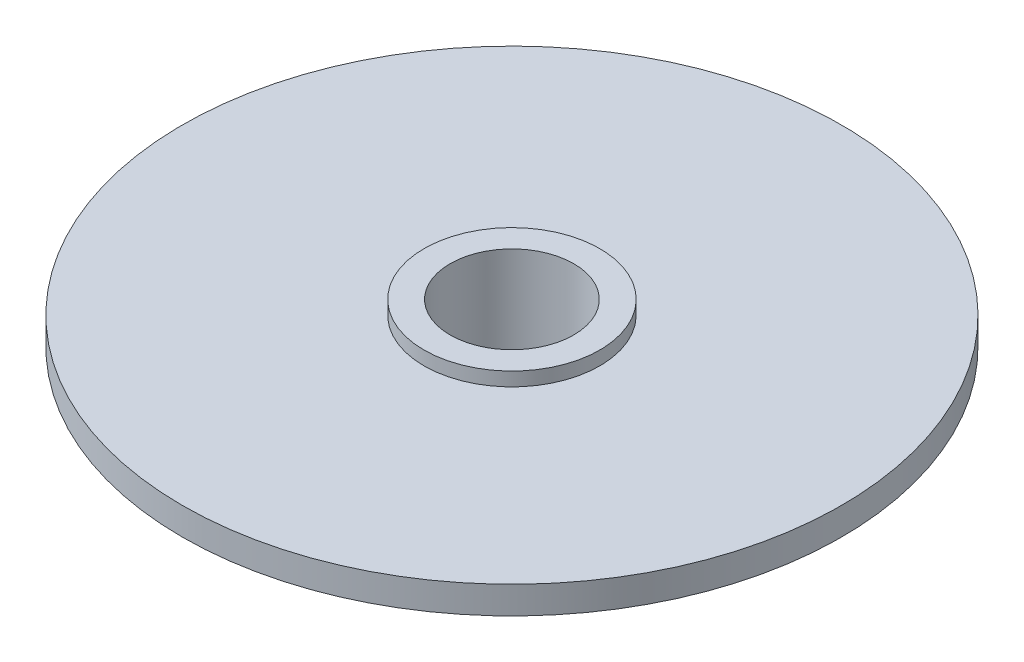
ISO-10303-21;
HEADER;
FILE_DESCRIPTION(('STEP AP214'),'2;1');
FILE_NAME('part.step','',(''),(''),'','','');
FILE_SCHEMA(('AUTOMOTIVE_DESIGN { 1 0 10303 214 1 1 1 1 }'));
ENDSEC;
DATA;
#1=APPLICATION_CONTEXT('core data for automotive mechanical design processes');
#2=APPLICATION_PROTOCOL_DEFINITION('international standard','automotive_design',2000,#1);
#3=PRODUCT_CONTEXT('',#1,'mechanical');
#4=PRODUCT('Part','Part','',(#3));
#5=PRODUCT_RELATED_PRODUCT_CATEGORY('part','',(#4));
#6=PRODUCT_DEFINITION_FORMATION('','',#4);
#7=PRODUCT_DEFINITION_CONTEXT('part definition',#1,'design');
#8=PRODUCT_DEFINITION('design','',#6,#7);
#9=PRODUCT_DEFINITION_SHAPE('','',#8);
#10=(LENGTH_UNIT() NAMED_UNIT(*) SI_UNIT(.MILLI.,.METRE.));
#11=(NAMED_UNIT(*) PLANE_ANGLE_UNIT() SI_UNIT($,.RADIAN.));
#12=(NAMED_UNIT(*) SI_UNIT($,.STERADIAN.) SOLID_ANGLE_UNIT());
#13=UNCERTAINTY_MEASURE_WITH_UNIT(LENGTH_MEASURE(1.E-05),#10,'distance_accuracy_value','');
#14=(GEOMETRIC_REPRESENTATION_CONTEXT(3) GLOBAL_UNCERTAINTY_ASSIGNED_CONTEXT((#13)) GLOBAL_UNIT_ASSIGNED_CONTEXT((#10,
#11,#12)) REPRESENTATION_CONTEXT('',''));
#15=CARTESIAN_POINT('',(0.,0.,0.));
#16=DIRECTION('',(0.,0.,1.));
#17=DIRECTION('',(1.,0.,0.));
#18=AXIS2_PLACEMENT_3D('',#15,#16,#17);
#19=CARTESIAN_POINT('',(0.,10.,0.));
#20=DIRECTION('',(0.,1.,0.));
#21=DIRECTION('',(0.,0.,1.));
#22=AXIS2_PLACEMENT_3D('',#19,#20,#21);
#23=PLANE('',#22);
#24=CARTESIAN_POINT('',(0.,10.,0.));
#25=DIRECTION('',(0.,1.,0.));
#26=DIRECTION('',(0.,0.,1.));
#27=AXIS2_PLACEMENT_3D('',#24,#25,#26);
#28=CIRCLE('',#27,120.);
#29=CARTESIAN_POINT('',(0.,10.,120.));
#30=VERTEX_POINT('',#29);
#31=EDGE_CURVE('E38',#30,#30,#28,.T.);
#32=ORIENTED_EDGE('',*,*,#31,.T.);
#33=EDGE_LOOP('',(#32));
#34=FACE_BOUND('',#33,.T.);
#35=CARTESIAN_POINT('',(0.,10.,0.));
#36=DIRECTION('',(0.,1.,0.));
#37=DIRECTION('',(0.,0.,1.));
#38=AXIS2_PLACEMENT_3D('',#35,#36,#37);
#39=CIRCLE('',#38,32.);
#40=CARTESIAN_POINT('',(0.,10.,32.));
#41=VERTEX_POINT('',#40);
#42=EDGE_CURVE('E55',#41,#41,#39,.T.);
#43=ORIENTED_EDGE('',*,*,#42,.F.);
#44=EDGE_LOOP('',(#43));
#45=FACE_BOUND('',#44,.T.);
#46=ADVANCED_FACE('F31',(#34,#45),#23,.T.);
#47=CARTESIAN_POINT('',(0.,0.,0.));
#48=DIRECTION('',(0.,1.,0.));
#49=DIRECTION('',(0.,0.,1.));
#50=AXIS2_PLACEMENT_3D('',#47,#48,#49);
#51=PLANE('',#50);
#52=CARTESIAN_POINT('',(0.,0.,0.));
#53=DIRECTION('',(0.,1.,0.));
#54=DIRECTION('',(0.,0.,1.));
#55=AXIS2_PLACEMENT_3D('',#52,#53,#54);
#56=CIRCLE('',#55,120.);
#57=CARTESIAN_POINT('',(0.,0.,120.));
#58=VERTEX_POINT('',#57);
#59=EDGE_CURVE('E42',#58,#58,#56,.T.);
#60=ORIENTED_EDGE('',*,*,#59,.F.);
#61=EDGE_LOOP('',(#60));
#62=FACE_BOUND('',#61,.T.);
#63=CARTESIAN_POINT('',(0.,0.,0.));
#64=DIRECTION('',(0.,1.,0.));
#65=DIRECTION('',(0.,0.,1.));
#66=AXIS2_PLACEMENT_3D('',#63,#64,#65);
#67=CIRCLE('',#66,32.);
#68=CARTESIAN_POINT('',(0.,0.,32.));
#69=VERTEX_POINT('',#68);
#70=EDGE_CURVE('E10',#69,#69,#67,.F.);
#71=ORIENTED_EDGE('',*,*,#70,.F.);
#72=EDGE_LOOP('',(#71));
#73=FACE_BOUND('',#72,.T.);
#74=ADVANCED_FACE('F82',(#62,#73),#51,.F.);
#75=CARTESIAN_POINT('',(0.,10.,0.));
#76=DIRECTION('',(0.,-1.,0.));
#77=DIRECTION('',(0.,0.,-1.));
#78=AXIS2_PLACEMENT_3D('',#75,#76,#77);
#79=CYLINDRICAL_SURFACE('',#78,120.);
#80=ORIENTED_EDGE('',*,*,#31,.F.);
#81=EDGE_LOOP('',(#80));
#82=FACE_BOUND('',#81,.T.);
#83=ORIENTED_EDGE('',*,*,#59,.T.);
#84=EDGE_LOOP('',(#83));
#85=FACE_BOUND('',#84,.T.);
#86=ADVANCED_FACE('F33',(#82,#85),#79,.T.);
#87=CARTESIAN_POINT('',(0.,10.,0.));
#88=DIRECTION('',(0.,-1.,0.));
#89=DIRECTION('',(0.,0.,-1.));
#90=AXIS2_PLACEMENT_3D('',#87,#88,#89);
#91=CYLINDRICAL_SURFACE('',#90,22.5);
#92=CARTESIAN_POINT('',(0.,-40.,0.));
#93=DIRECTION('',(0.,-1.,0.));
#94=DIRECTION('',(0.,0.,-1.));
#95=AXIS2_PLACEMENT_3D('',#92,#93,#94);
#96=CIRCLE('',#95,22.5);
#97=CARTESIAN_POINT('',(0.,-40.,-22.5));
#98=VERTEX_POINT('',#97);
#99=EDGE_CURVE('E51',#98,#98,#96,.T.);
#100=ORIENTED_EDGE('',*,*,#99,.T.);
#101=EDGE_LOOP('',(#100));
#102=FACE_BOUND('',#101,.T.);
#103=CARTESIAN_POINT('',(0.,15.,0.));
#104=DIRECTION('',(0.,1.,0.));
#105=DIRECTION('',(0.,0.,1.));
#106=AXIS2_PLACEMENT_3D('',#103,#104,#105);
#107=CIRCLE('',#106,22.5);
#108=CARTESIAN_POINT('',(0.,15.,22.5));
#109=VERTEX_POINT('',#108);
#110=EDGE_CURVE('E58',#109,#109,#107,.T.);
#111=ORIENTED_EDGE('',*,*,#110,.T.);
#112=EDGE_LOOP('',(#111));
#113=FACE_BOUND('',#112,.T.);
#114=ADVANCED_FACE('F64',(#102,#113),#91,.F.);
#115=CARTESIAN_POINT('',(0.,-40.,0.));
#116=DIRECTION('',(0.,-1.,0.));
#117=DIRECTION('',(0.,0.,-1.));
#118=AXIS2_PLACEMENT_3D('',#115,#116,#117);
#119=PLANE('',#118);
#120=CARTESIAN_POINT('',(0.,-40.,0.));
#121=DIRECTION('',(0.,-1.,0.));
#122=DIRECTION('',(0.,0.,-1.));
#123=AXIS2_PLACEMENT_3D('',#120,#121,#122);
#124=CIRCLE('',#123,32.);
#125=CARTESIAN_POINT('',(0.,-40.,-32.));
#126=VERTEX_POINT('',#125);
#127=EDGE_CURVE('E47',#126,#126,#124,.T.);
#128=ORIENTED_EDGE('',*,*,#127,.T.);
#129=EDGE_LOOP('',(#128));
#130=FACE_BOUND('',#129,.T.);
#131=ORIENTED_EDGE('',*,*,#99,.F.);
#132=EDGE_LOOP('',(#131));
#133=FACE_BOUND('',#132,.T.);
#134=ADVANCED_FACE('F78',(#130,#133),#119,.T.);
#135=CARTESIAN_POINT('',(0.,-40.,0.));
#136=DIRECTION('',(0.,1.,0.));
#137=DIRECTION('',(0.,0.,1.));
#138=AXIS2_PLACEMENT_3D('',#135,#136,#137);
#139=CYLINDRICAL_SURFACE('',#138,32.);
#140=ORIENTED_EDGE('',*,*,#127,.F.);
#141=EDGE_LOOP('',(#140));
#142=FACE_BOUND('',#141,.T.);
#143=ORIENTED_EDGE('',*,*,#70,.T.);
#144=EDGE_LOOP('',(#143));
#145=FACE_BOUND('',#144,.T.);
#146=ADVANCED_FACE('F69',(#142,#145),#139,.T.);
#147=CARTESIAN_POINT('',(0.,15.,0.));
#148=DIRECTION('',(0.,1.,0.));
#149=DIRECTION('',(0.,0.,1.));
#150=AXIS2_PLACEMENT_3D('',#147,#148,#149);
#151=PLANE('',#150);
#152=CARTESIAN_POINT('',(0.,15.,0.));
#153=DIRECTION('',(0.,1.,0.));
#154=DIRECTION('',(0.,0.,1.));
#155=AXIS2_PLACEMENT_3D('',#152,#153,#154);
#156=CIRCLE('',#155,32.);
#157=CARTESIAN_POINT('',(0.,15.,32.));
#158=VERTEX_POINT('',#157);
#159=EDGE_CURVE('E54',#158,#158,#156,.T.);
#160=ORIENTED_EDGE('',*,*,#159,.T.);
#161=EDGE_LOOP('',(#160));
#162=FACE_BOUND('',#161,.T.);
#163=ORIENTED_EDGE('',*,*,#110,.F.);
#164=EDGE_LOOP('',(#163));
#165=FACE_BOUND('',#164,.T.);
#166=ADVANCED_FACE('F66',(#162,#165),#151,.T.);
#167=CARTESIAN_POINT('',(0.,15.,0.));
#168=DIRECTION('',(0.,-1.,0.));
#169=DIRECTION('',(0.,0.,-1.));
#170=AXIS2_PLACEMENT_3D('',#167,#168,#169);
#171=CYLINDRICAL_SURFACE('',#170,32.);
#172=ORIENTED_EDGE('',*,*,#159,.F.);
#173=EDGE_LOOP('',(#172));
#174=FACE_BOUND('',#173,.T.);
#175=ORIENTED_EDGE('',*,*,#42,.T.);
#176=EDGE_LOOP('',(#175));
#177=FACE_BOUND('',#176,.T.);
#178=ADVANCED_FACE('F68',(#174,#177),#171,.T.);
#179=CLOSED_SHELL('',(#46,#74,#86,#114,#134,#146,#166,#178));
#180=MANIFOLD_SOLID_BREP('B2',#179);
#181=ADVANCED_BREP_SHAPE_REPRESENTATION('',(#18,#180),#14);
#182=SHAPE_DEFINITION_REPRESENTATION(#9,#181);
ENDSEC;
END-ISO-10303-21;
